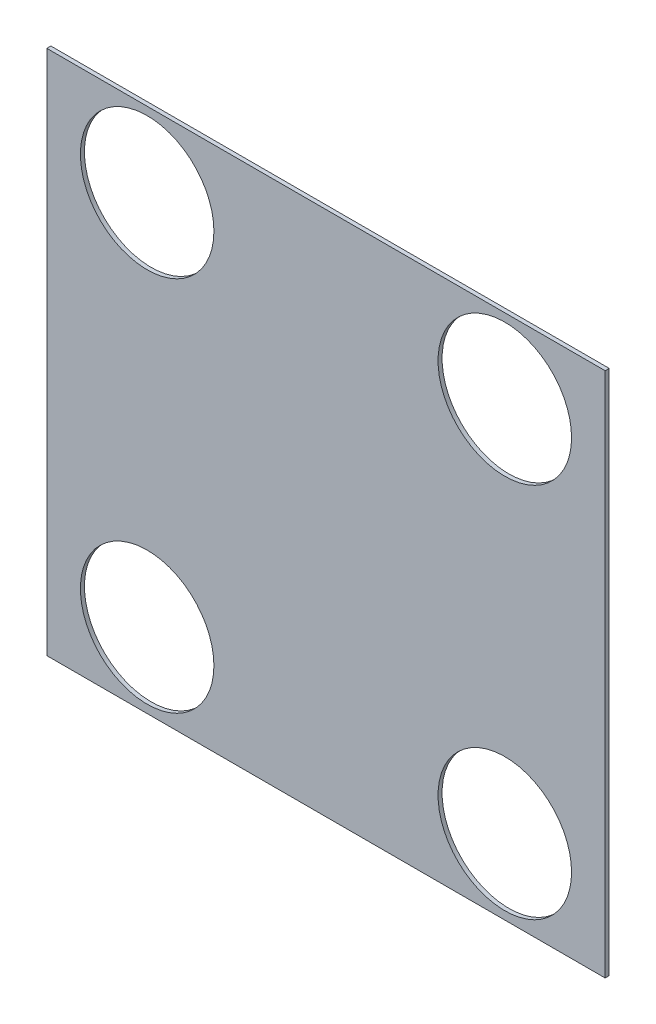
ISO-10303-21;
HEADER;
FILE_DESCRIPTION(('STEP AP214'),'2;1');
FILE_NAME('part.step','',(''),(''),'','','');
FILE_SCHEMA(('AUTOMOTIVE_DESIGN { 1 0 10303 214 1 1 1 1 }'));
ENDSEC;
DATA;
#1=APPLICATION_CONTEXT('core data for automotive mechanical design processes');
#2=APPLICATION_PROTOCOL_DEFINITION('international standard','automotive_design',2000,#1);
#3=PRODUCT_CONTEXT('',#1,'mechanical');
#4=PRODUCT('Part','Part','',(#3));
#5=PRODUCT_RELATED_PRODUCT_CATEGORY('part','',(#4));
#6=PRODUCT_DEFINITION_FORMATION('','',#4);
#7=PRODUCT_DEFINITION_CONTEXT('part definition',#1,'design');
#8=PRODUCT_DEFINITION('design','',#6,#7);
#9=PRODUCT_DEFINITION_SHAPE('','',#8);
#10=(LENGTH_UNIT() NAMED_UNIT(*) SI_UNIT(.MILLI.,.METRE.));
#11=(NAMED_UNIT(*) PLANE_ANGLE_UNIT() SI_UNIT($,.RADIAN.));
#12=(NAMED_UNIT(*) SI_UNIT($,.STERADIAN.) SOLID_ANGLE_UNIT());
#13=UNCERTAINTY_MEASURE_WITH_UNIT(LENGTH_MEASURE(1.E-05),#10,'distance_accuracy_value','');
#14=(GEOMETRIC_REPRESENTATION_CONTEXT(3) GLOBAL_UNCERTAINTY_ASSIGNED_CONTEXT((#13)) GLOBAL_UNIT_ASSIGNED_CONTEXT((#10,
#11,#12)) REPRESENTATION_CONTEXT('',''));
#15=CARTESIAN_POINT('',(0.,0.,0.));
#16=DIRECTION('',(0.,0.,1.));
#17=DIRECTION('',(1.,0.,0.));
#18=AXIS2_PLACEMENT_3D('',#15,#16,#17);
#19=CARTESIAN_POINT('',(0.,650.,5.));
#20=DIRECTION('',(1.,0.,0.));
#21=DIRECTION('',(0.,0.,-1.));
#22=AXIS2_PLACEMENT_3D('',#19,#20,#21);
#23=PLANE('',#22);
#24=DIRECTION('',(0.,-1.,0.));
#25=VECTOR('',#24,1.);
#26=CARTESIAN_POINT('',(0.,650.,0.));
#27=LINE('',#26,#25);
#28=CARTESIAN_POINT('',(0.,650.,0.));
#29=VERTEX_POINT('',#28);
#30=CARTESIAN_POINT('',(0.,0.,0.));
#31=VERTEX_POINT('',#30);
#32=EDGE_CURVE('E102',#29,#31,#27,.T.);
#33=ORIENTED_EDGE('',*,*,#32,.T.);
#34=DIRECTION('',(0.,0.,-1.));
#35=VECTOR('',#34,1.);
#36=CARTESIAN_POINT('',(0.,0.,5.));
#37=LINE('',#36,#35);
#38=CARTESIAN_POINT('',(0.,0.,5.));
#39=VERTEX_POINT('',#38);
#40=EDGE_CURVE('E11',#39,#31,#37,.T.);
#41=ORIENTED_EDGE('',*,*,#40,.F.);
#42=DIRECTION('',(0.,-1.,0.));
#43=VECTOR('',#42,1.);
#44=CARTESIAN_POINT('',(0.,650.,5.));
#45=LINE('',#44,#43);
#46=CARTESIAN_POINT('',(0.,650.,5.));
#47=VERTEX_POINT('',#46);
#48=EDGE_CURVE('E90',#47,#39,#45,.T.);
#49=ORIENTED_EDGE('',*,*,#48,.F.);
#50=DIRECTION('',(0.,0.,-1.));
#51=VECTOR('',#50,1.);
#52=CARTESIAN_POINT('',(0.,650.,5.));
#53=LINE('',#52,#51);
#54=EDGE_CURVE('E98',#47,#29,#53,.T.);
#55=ORIENTED_EDGE('',*,*,#54,.T.);
#56=EDGE_LOOP('',(#33,#41,#49,#55));
#57=FACE_BOUND('',#56,.T.);
#58=ADVANCED_FACE('F39',(#57),#23,.F.);
#59=CARTESIAN_POINT('',(0.,0.,5.));
#60=DIRECTION('',(0.,1.,0.));
#61=DIRECTION('',(0.,0.,1.));
#62=AXIS2_PLACEMENT_3D('',#59,#60,#61);
#63=PLANE('',#62);
#64=DIRECTION('',(1.,0.,0.));
#65=VECTOR('',#64,1.);
#66=CARTESIAN_POINT('',(0.,0.,0.));
#67=LINE('',#66,#65);
#68=CARTESIAN_POINT('',(690.,0.,0.));
#69=VERTEX_POINT('',#68);
#70=EDGE_CURVE('E94',#31,#69,#67,.T.);
#71=ORIENTED_EDGE('',*,*,#70,.T.);
#72=DIRECTION('',(0.,0.,-1.));
#73=VECTOR('',#72,1.);
#74=CARTESIAN_POINT('',(690.,0.,5.));
#75=LINE('',#74,#73);
#76=CARTESIAN_POINT('',(690.,0.,5.));
#77=VERTEX_POINT('',#76);
#78=EDGE_CURVE('E47',#77,#69,#75,.T.);
#79=ORIENTED_EDGE('',*,*,#78,.F.);
#80=DIRECTION('',(1.,0.,0.));
#81=VECTOR('',#80,1.);
#82=CARTESIAN_POINT('',(0.,0.,5.));
#83=LINE('',#82,#81);
#84=EDGE_CURVE('E85',#39,#77,#83,.T.);
#85=ORIENTED_EDGE('',*,*,#84,.F.);
#86=ORIENTED_EDGE('',*,*,#40,.T.);
#87=EDGE_LOOP('',(#71,#79,#85,#86));
#88=FACE_BOUND('',#87,.T.);
#89=ADVANCED_FACE('F93',(#88),#63,.F.);
#90=CARTESIAN_POINT('',(690.,0.,5.));
#91=DIRECTION('',(-1.,0.,0.));
#92=DIRECTION('',(0.,0.,1.));
#93=AXIS2_PLACEMENT_3D('',#90,#91,#92);
#94=PLANE('',#93);
#95=DIRECTION('',(0.,1.,0.));
#96=VECTOR('',#95,1.);
#97=CARTESIAN_POINT('',(690.,0.,0.));
#98=LINE('',#97,#96);
#99=CARTESIAN_POINT('',(690.,650.,0.));
#100=VERTEX_POINT('',#99);
#101=EDGE_CURVE('E72',#69,#100,#98,.T.);
#102=ORIENTED_EDGE('',*,*,#101,.T.);
#103=DIRECTION('',(0.,0.,-1.));
#104=VECTOR('',#103,1.);
#105=CARTESIAN_POINT('',(690.,650.,5.));
#106=LINE('',#105,#104);
#107=CARTESIAN_POINT('',(690.,650.,5.));
#108=VERTEX_POINT('',#107);
#109=EDGE_CURVE('E95',#108,#100,#106,.T.);
#110=ORIENTED_EDGE('',*,*,#109,.F.);
#111=DIRECTION('',(0.,1.,0.));
#112=VECTOR('',#111,1.);
#113=CARTESIAN_POINT('',(690.,0.,5.));
#114=LINE('',#113,#112);
#115=EDGE_CURVE('E88',#77,#108,#114,.T.);
#116=ORIENTED_EDGE('',*,*,#115,.F.);
#117=ORIENTED_EDGE('',*,*,#78,.T.);
#118=EDGE_LOOP('',(#102,#110,#116,#117));
#119=FACE_BOUND('',#118,.T.);
#120=ADVANCED_FACE('F96',(#119),#94,.F.);
#121=CARTESIAN_POINT('',(690.,650.,5.));
#122=DIRECTION('',(0.,-1.,0.));
#123=DIRECTION('',(0.,0.,-1.));
#124=AXIS2_PLACEMENT_3D('',#121,#122,#123);
#125=PLANE('',#124);
#126=DIRECTION('',(-1.,0.,0.));
#127=VECTOR('',#126,1.);
#128=CARTESIAN_POINT('',(690.,650.,0.));
#129=LINE('',#128,#127);
#130=EDGE_CURVE('E78',#100,#29,#129,.T.);
#131=ORIENTED_EDGE('',*,*,#130,.T.);
#132=ORIENTED_EDGE('',*,*,#54,.F.);
#133=DIRECTION('',(-1.,0.,0.));
#134=VECTOR('',#133,1.);
#135=CARTESIAN_POINT('',(690.,650.,5.));
#136=LINE('',#135,#134);
#137=EDGE_CURVE('E55',#108,#47,#136,.T.);
#138=ORIENTED_EDGE('',*,*,#137,.F.);
#139=ORIENTED_EDGE('',*,*,#109,.T.);
#140=EDGE_LOOP('',(#131,#132,#138,#139));
#141=FACE_BOUND('',#140,.T.);
#142=ADVANCED_FACE('F110',(#141),#125,.F.);
#143=CARTESIAN_POINT('',(0.,0.,5.));
#144=DIRECTION('',(0.,0.,1.));
#145=DIRECTION('',(1.,0.,0.));
#146=AXIS2_PLACEMENT_3D('',#143,#144,#145);
#147=PLANE('',#146);
#148=CARTESIAN_POINT('',(566.,557.5,5.));
#149=DIRECTION('',(0.,0.,1.));
#150=DIRECTION('',(1.,0.,0.));
#151=AXIS2_PLACEMENT_3D('',#148,#149,#150);
#152=CIRCLE('',#151,82.5);
#153=CARTESIAN_POINT('',(648.5,557.5,5.));
#154=VERTEX_POINT('',#153);
#155=EDGE_CURVE('E134',#154,#154,#152,.T.);
#156=ORIENTED_EDGE('',*,*,#155,.F.);
#157=EDGE_LOOP('',(#156));
#158=FACE_BOUND('',#157,.T.);
#159=CARTESIAN_POINT('',(566.,92.5,5.));
#160=DIRECTION('',(0.,0.,1.));
#161=DIRECTION('',(1.,0.,0.));
#162=AXIS2_PLACEMENT_3D('',#159,#160,#161);
#163=CIRCLE('',#162,82.5);
#164=CARTESIAN_POINT('',(648.5,92.5,5.));
#165=VERTEX_POINT('',#164);
#166=EDGE_CURVE('E128',#165,#165,#163,.T.);
#167=ORIENTED_EDGE('',*,*,#166,.F.);
#168=EDGE_LOOP('',(#167));
#169=FACE_BOUND('',#168,.T.);
#170=CARTESIAN_POINT('',(124.,557.5,5.));
#171=DIRECTION('',(0.,0.,1.));
#172=DIRECTION('',(1.,0.,0.));
#173=AXIS2_PLACEMENT_3D('',#170,#171,#172);
#174=CIRCLE('',#173,82.5);
#175=CARTESIAN_POINT('',(206.5,557.5,5.));
#176=VERTEX_POINT('',#175);
#177=EDGE_CURVE('E122',#176,#176,#174,.T.);
#178=ORIENTED_EDGE('',*,*,#177,.F.);
#179=EDGE_LOOP('',(#178));
#180=FACE_BOUND('',#179,.T.);
#181=CARTESIAN_POINT('',(124.,92.5,5.));
#182=DIRECTION('',(0.,0.,1.));
#183=DIRECTION('',(1.,0.,0.));
#184=AXIS2_PLACEMENT_3D('',#181,#182,#183);
#185=CIRCLE('',#184,82.5);
#186=CARTESIAN_POINT('',(206.5,92.5,5.));
#187=VERTEX_POINT('',#186);
#188=EDGE_CURVE('E116',#187,#187,#185,.T.);
#189=ORIENTED_EDGE('',*,*,#188,.F.);
#190=EDGE_LOOP('',(#189));
#191=FACE_BOUND('',#190,.T.);
#192=ORIENTED_EDGE('',*,*,#48,.T.);
#193=ORIENTED_EDGE('',*,*,#84,.T.);
#194=ORIENTED_EDGE('',*,*,#115,.T.);
#195=ORIENTED_EDGE('',*,*,#137,.T.);
#196=EDGE_LOOP('',(#192,#193,#194,#195));
#197=FACE_BOUND('',#196,.T.);
#198=ADVANCED_FACE('F86',(#158,#169,#180,#191,#197),#147,.T.);
#199=CARTESIAN_POINT('',(0.,0.,0.));
#200=DIRECTION('',(0.,0.,1.));
#201=DIRECTION('',(1.,0.,0.));
#202=AXIS2_PLACEMENT_3D('',#199,#200,#201);
#203=PLANE('',#202);
#204=CARTESIAN_POINT('',(566.,557.5,0.));
#205=DIRECTION('',(0.,0.,1.));
#206=DIRECTION('',(1.,0.,0.));
#207=AXIS2_PLACEMENT_3D('',#204,#205,#206);
#208=CIRCLE('',#207,82.5);
#209=CARTESIAN_POINT('',(648.5,557.5,0.));
#210=VERTEX_POINT('',#209);
#211=EDGE_CURVE('E131',#210,#210,#208,.T.);
#212=ORIENTED_EDGE('',*,*,#211,.T.);
#213=EDGE_LOOP('',(#212));
#214=FACE_BOUND('',#213,.T.);
#215=CARTESIAN_POINT('',(566.,92.5,0.));
#216=DIRECTION('',(0.,0.,1.));
#217=DIRECTION('',(1.,0.,0.));
#218=AXIS2_PLACEMENT_3D('',#215,#216,#217);
#219=CIRCLE('',#218,82.5);
#220=CARTESIAN_POINT('',(648.5,92.5,0.));
#221=VERTEX_POINT('',#220);
#222=EDGE_CURVE('E125',#221,#221,#219,.T.);
#223=ORIENTED_EDGE('',*,*,#222,.T.);
#224=EDGE_LOOP('',(#223));
#225=FACE_BOUND('',#224,.T.);
#226=CARTESIAN_POINT('',(124.,557.5,0.));
#227=DIRECTION('',(0.,0.,1.));
#228=DIRECTION('',(1.,0.,0.));
#229=AXIS2_PLACEMENT_3D('',#226,#227,#228);
#230=CIRCLE('',#229,82.5);
#231=CARTESIAN_POINT('',(206.5,557.5,0.));
#232=VERTEX_POINT('',#231);
#233=EDGE_CURVE('E119',#232,#232,#230,.T.);
#234=ORIENTED_EDGE('',*,*,#233,.T.);
#235=EDGE_LOOP('',(#234));
#236=FACE_BOUND('',#235,.T.);
#237=CARTESIAN_POINT('',(124.,92.5,0.));
#238=DIRECTION('',(0.,0.,1.));
#239=DIRECTION('',(1.,0.,0.));
#240=AXIS2_PLACEMENT_3D('',#237,#238,#239);
#241=CIRCLE('',#240,82.5);
#242=CARTESIAN_POINT('',(206.5,92.5,0.));
#243=VERTEX_POINT('',#242);
#244=EDGE_CURVE('E105',#243,#243,#241,.T.);
#245=ORIENTED_EDGE('',*,*,#244,.T.);
#246=EDGE_LOOP('',(#245));
#247=FACE_BOUND('',#246,.T.);
#248=ORIENTED_EDGE('',*,*,#32,.F.);
#249=ORIENTED_EDGE('',*,*,#130,.F.);
#250=ORIENTED_EDGE('',*,*,#101,.F.);
#251=ORIENTED_EDGE('',*,*,#70,.F.);
#252=EDGE_LOOP('',(#248,#249,#250,#251));
#253=FACE_BOUND('',#252,.T.);
#254=ADVANCED_FACE('F113',(#214,#225,#236,#247,#253),#203,.F.);
#255=CARTESIAN_POINT('',(124.,92.5,0.));
#256=DIRECTION('',(0.,0.,1.));
#257=DIRECTION('',(1.,0.,0.));
#258=AXIS2_PLACEMENT_3D('',#255,#256,#257);
#259=CYLINDRICAL_SURFACE('',#258,82.5);
#260=ORIENTED_EDGE('',*,*,#244,.F.);
#261=EDGE_LOOP('',(#260));
#262=FACE_BOUND('',#261,.T.);
#263=ORIENTED_EDGE('',*,*,#188,.T.);
#264=EDGE_LOOP('',(#263));
#265=FACE_BOUND('',#264,.T.);
#266=ADVANCED_FACE('F158',(#262,#265),#259,.F.);
#267=CARTESIAN_POINT('',(124.,557.5,0.));
#268=DIRECTION('',(0.,0.,1.));
#269=DIRECTION('',(1.,0.,0.));
#270=AXIS2_PLACEMENT_3D('',#267,#268,#269);
#271=CYLINDRICAL_SURFACE('',#270,82.5);
#272=ORIENTED_EDGE('',*,*,#233,.F.);
#273=EDGE_LOOP('',(#272));
#274=FACE_BOUND('',#273,.T.);
#275=ORIENTED_EDGE('',*,*,#177,.T.);
#276=EDGE_LOOP('',(#275));
#277=FACE_BOUND('',#276,.T.);
#278=ADVANCED_FACE('F160',(#274,#277),#271,.F.);
#279=CARTESIAN_POINT('',(566.,92.5,0.));
#280=DIRECTION('',(0.,0.,1.));
#281=DIRECTION('',(1.,0.,0.));
#282=AXIS2_PLACEMENT_3D('',#279,#280,#281);
#283=CYLINDRICAL_SURFACE('',#282,82.5);
#284=ORIENTED_EDGE('',*,*,#222,.F.);
#285=EDGE_LOOP('',(#284));
#286=FACE_BOUND('',#285,.T.);
#287=ORIENTED_EDGE('',*,*,#166,.T.);
#288=EDGE_LOOP('',(#287));
#289=FACE_BOUND('',#288,.T.);
#290=ADVANCED_FACE('F145',(#286,#289),#283,.F.);
#291=CARTESIAN_POINT('',(566.,557.5,0.));
#292=DIRECTION('',(0.,0.,1.));
#293=DIRECTION('',(1.,0.,0.));
#294=AXIS2_PLACEMENT_3D('',#291,#292,#293);
#295=CYLINDRICAL_SURFACE('',#294,82.5);
#296=ORIENTED_EDGE('',*,*,#211,.F.);
#297=EDGE_LOOP('',(#296));
#298=FACE_BOUND('',#297,.T.);
#299=ORIENTED_EDGE('',*,*,#155,.T.);
#300=EDGE_LOOP('',(#299));
#301=FACE_BOUND('',#300,.T.);
#302=ADVANCED_FACE('F142',(#298,#301),#295,.F.);
#303=CLOSED_SHELL('',(#58,#89,#120,#142,#198,#254,#266,#278,#290,#302));
#304=MANIFOLD_SOLID_BREP('B2',#303);
#305=ADVANCED_BREP_SHAPE_REPRESENTATION('',(#18,#304),#14);
#306=SHAPE_DEFINITION_REPRESENTATION(#9,#305);
ENDSEC;
END-ISO-10303-21;
